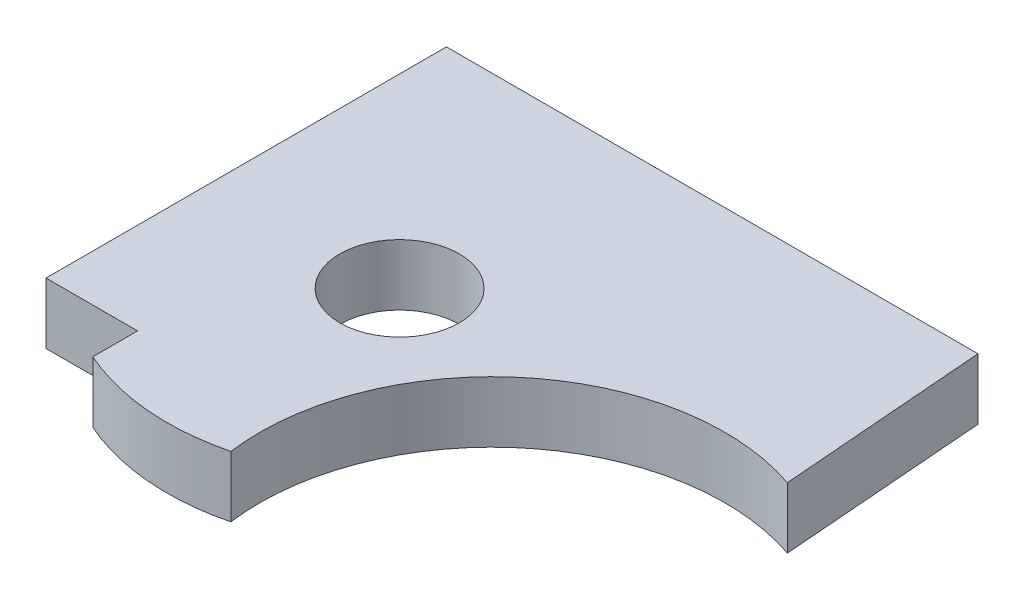
ISO-10303-21;
HEADER;
FILE_DESCRIPTION(('STEP AP214'),'2;1');
FILE_NAME('part.step','',(''),(''),'','','');
FILE_SCHEMA(('AUTOMOTIVE_DESIGN { 1 0 10303 214 1 1 1 1 }'));
ENDSEC;
DATA;
#1=APPLICATION_CONTEXT('core data for automotive mechanical design processes');
#2=APPLICATION_PROTOCOL_DEFINITION('international standard','automotive_design',2000,#1);
#3=PRODUCT_CONTEXT('',#1,'mechanical');
#4=PRODUCT('Part','Part','',(#3));
#5=PRODUCT_RELATED_PRODUCT_CATEGORY('part','',(#4));
#6=PRODUCT_DEFINITION_FORMATION('','',#4);
#7=PRODUCT_DEFINITION_CONTEXT('part definition',#1,'design');
#8=PRODUCT_DEFINITION('design','',#6,#7);
#9=PRODUCT_DEFINITION_SHAPE('','',#8);
#10=(LENGTH_UNIT() NAMED_UNIT(*) SI_UNIT(.MILLI.,.METRE.));
#11=(NAMED_UNIT(*) PLANE_ANGLE_UNIT() SI_UNIT($,.RADIAN.));
#12=(NAMED_UNIT(*) SI_UNIT($,.STERADIAN.) SOLID_ANGLE_UNIT());
#13=UNCERTAINTY_MEASURE_WITH_UNIT(LENGTH_MEASURE(1.E-05),#10,'distance_accuracy_value','');
#14=(GEOMETRIC_REPRESENTATION_CONTEXT(3) GLOBAL_UNCERTAINTY_ASSIGNED_CONTEXT((#13)) GLOBAL_UNIT_ASSIGNED_CONTEXT((#10,
#11,#12)) REPRESENTATION_CONTEXT('',''));
#15=CARTESIAN_POINT('',(0.,0.,0.));
#16=DIRECTION('',(0.,0.,1.));
#17=DIRECTION('',(1.,0.,0.));
#18=AXIS2_PLACEMENT_3D('',#15,#16,#17);
#19=CARTESIAN_POINT('',(137.296761577573,4.,-4.30517733110572));
#20=DIRECTION('',(0.,-1.,0.));
#21=DIRECTION('',(0.,0.,-1.));
#22=AXIS2_PLACEMENT_3D('',#19,#20,#21);
#23=CYLINDRICAL_SURFACE('',#22,15.2405233009274);
#24=CARTESIAN_POINT('',(137.296761577573,0.,-4.30517733110572));
#25=DIRECTION('',(0.,1.,0.));
#26=DIRECTION('',(0.,0.,1.));
#27=AXIS2_PLACEMENT_3D('',#24,#25,#26);
#28=CIRCLE('',#27,15.2405233009274);
#29=CARTESIAN_POINT('',(142.200280718909,0.,-18.7353211459351));
#30=VERTEX_POINT('',#29);
#31=CARTESIAN_POINT('',(122.1918078265,0.,-2.27689661481613));
#32=VERTEX_POINT('',#31);
#33=EDGE_CURVE('E202',#30,#32,#28,.T.);
#34=ORIENTED_EDGE('',*,*,#33,.F.);
#35=DIRECTION('',(0.,-1.,0.));
#36=VECTOR('',#35,1.);
#37=CARTESIAN_POINT('',(142.200280718909,4.,-18.7353211459351));
#38=LINE('',#37,#36);
#39=CARTESIAN_POINT('',(142.200280718909,4.,-18.7353211459351));
#40=VERTEX_POINT('',#39);
#41=EDGE_CURVE('E12',#40,#30,#38,.T.);
#42=ORIENTED_EDGE('',*,*,#41,.F.);
#43=CARTESIAN_POINT('',(137.296761577573,4.,-4.30517733110572));
#44=DIRECTION('',(0.,1.,0.));
#45=DIRECTION('',(0.,0.,1.));
#46=AXIS2_PLACEMENT_3D('',#43,#44,#45);
#47=CIRCLE('',#46,15.2405233009274);
#48=CARTESIAN_POINT('',(122.1918078265,4.,-2.27689661481613));
#49=VERTEX_POINT('',#48);
#50=EDGE_CURVE('E166',#40,#49,#47,.T.);
#51=ORIENTED_EDGE('',*,*,#50,.T.);
#52=DIRECTION('',(0.,-1.,0.));
#53=VECTOR('',#52,1.);
#54=CARTESIAN_POINT('',(122.1918078265,4.,-2.27689661481613));
#55=LINE('',#54,#53);
#56=EDGE_CURVE('E99',#49,#32,#55,.T.);
#57=ORIENTED_EDGE('',*,*,#56,.T.);
#58=EDGE_LOOP('',(#34,#42,#51,#57));
#59=FACE_BOUND('',#58,.T.);
#60=ADVANCED_FACE('F43',(#59),#23,.F.);
#61=CARTESIAN_POINT('',(142.789864863277,4.,-11.2561584708997));
#62=DIRECTION('',(-0.996907303645276,0.,0.0785864360987606));
#63=DIRECTION('',(0.0785864360987606,0.,0.996907303645276));
#64=AXIS2_PLACEMENT_3D('',#61,#62,#63);
#65=PLANE('',#64);
#66=DIRECTION('',(-0.0785864360987606,0.,-0.996907303645277));
#67=VECTOR('',#66,1.);
#68=CARTESIAN_POINT('',(142.789864863277,0.,-11.2561584708997));
#69=LINE('',#68,#67);
#70=CARTESIAN_POINT('',(141.131312829856,0.,-32.2957006320331));
#71=VERTEX_POINT('',#70);
#72=EDGE_CURVE('E198',#30,#71,#69,.T.);
#73=ORIENTED_EDGE('',*,*,#72,.T.);
#74=DIRECTION('',(0.,-1.,0.));
#75=VECTOR('',#74,1.);
#76=CARTESIAN_POINT('',(141.131312829856,4.,-32.2957006320331));
#77=LINE('',#76,#75);
#78=CARTESIAN_POINT('',(141.131312829856,4.,-32.2957006320331));
#79=VERTEX_POINT('',#78);
#80=EDGE_CURVE('E52',#79,#71,#77,.T.);
#81=ORIENTED_EDGE('',*,*,#80,.F.);
#82=DIRECTION('',(-0.0785864360987606,0.,-0.996907303645277));
#83=VECTOR('',#82,1.);
#84=CARTESIAN_POINT('',(142.789864863277,4.,-11.2561584708997));
#85=LINE('',#84,#83);
#86=EDGE_CURVE('E162',#40,#79,#85,.T.);
#87=ORIENTED_EDGE('',*,*,#86,.F.);
#88=ORIENTED_EDGE('',*,*,#41,.T.);
#89=EDGE_LOOP('',(#73,#81,#87,#88));
#90=FACE_BOUND('',#89,.T.);
#91=ADVANCED_FACE('F199',(#90),#65,.F.);
#92=CARTESIAN_POINT('',(0.,4.,-32.2957006320331));
#93=DIRECTION('',(0.,0.,-1.));
#94=DIRECTION('',(-1.,0.,0.));
#95=AXIS2_PLACEMENT_3D('',#92,#93,#94);
#96=PLANE('',#95);
#97=DIRECTION('',(1.,0.,0.));
#98=VECTOR('',#97,1.);
#99=CARTESIAN_POINT('',(0.,0.,-32.2957006320331));
#100=LINE('',#99,#98);
#101=CARTESIAN_POINT('',(106.296761577572,0.,-32.2957006320331));
#102=VERTEX_POINT('',#101);
#103=EDGE_CURVE('E195',#102,#71,#100,.T.);
#104=ORIENTED_EDGE('',*,*,#103,.F.);
#105=DIRECTION('',(0.,-1.,0.));
#106=VECTOR('',#105,1.);
#107=CARTESIAN_POINT('',(106.296761577572,4.,-32.2957006320331));
#108=LINE('',#107,#106);
#109=CARTESIAN_POINT('',(106.296761577572,4.,-32.2957006320331));
#110=VERTEX_POINT('',#109);
#111=EDGE_CURVE('E188',#110,#102,#108,.T.);
#112=ORIENTED_EDGE('',*,*,#111,.F.);
#113=DIRECTION('',(1.,0.,0.));
#114=VECTOR('',#113,1.);
#115=CARTESIAN_POINT('',(0.,4.,-32.2957006320331));
#116=LINE('',#115,#114);
#117=EDGE_CURVE('E157',#110,#79,#116,.T.);
#118=ORIENTED_EDGE('',*,*,#117,.T.);
#119=ORIENTED_EDGE('',*,*,#80,.T.);
#120=EDGE_LOOP('',(#104,#112,#118,#119));
#121=FACE_BOUND('',#120,.T.);
#122=ADVANCED_FACE('F193',(#121),#96,.T.);
#123=CARTESIAN_POINT('',(106.296761577572,4.,0.));
#124=DIRECTION('',(1.,0.,0.));
#125=DIRECTION('',(0.,0.,-1.));
#126=AXIS2_PLACEMENT_3D('',#123,#124,#125);
#127=PLANE('',#126);
#128=DIRECTION('',(0.,0.,1.));
#129=VECTOR('',#128,1.);
#130=CARTESIAN_POINT('',(106.296761577572,0.,0.));
#131=LINE('',#130,#129);
#132=CARTESIAN_POINT('',(106.296761577572,0.,-6.05517733110575));
#133=VERTEX_POINT('',#132);
#134=EDGE_CURVE('E207',#102,#133,#131,.T.);
#135=ORIENTED_EDGE('',*,*,#134,.T.);
#136=DIRECTION('',(0.,-1.,0.));
#137=VECTOR('',#136,1.);
#138=CARTESIAN_POINT('',(106.296761577572,4.,-6.05517733110575));
#139=LINE('',#138,#137);
#140=CARTESIAN_POINT('',(106.296761577572,4.,-6.05517733110575));
#141=VERTEX_POINT('',#140);
#142=EDGE_CURVE('E136',#141,#133,#139,.T.);
#143=ORIENTED_EDGE('',*,*,#142,.F.);
#144=DIRECTION('',(0.,0.,1.));
#145=VECTOR('',#144,1.);
#146=CARTESIAN_POINT('',(106.296761577572,4.,0.));
#147=LINE('',#146,#145);
#148=EDGE_CURVE('E125',#110,#141,#147,.T.);
#149=ORIENTED_EDGE('',*,*,#148,.F.);
#150=ORIENTED_EDGE('',*,*,#111,.T.);
#151=EDGE_LOOP('',(#135,#143,#149,#150));
#152=FACE_BOUND('',#151,.T.);
#153=ADVANCED_FACE('F226',(#152),#127,.F.);
#154=CARTESIAN_POINT('',(0.,4.,-6.05517733110575));
#155=DIRECTION('',(0.,0.,-1.));
#156=DIRECTION('',(-1.,0.,0.));
#157=AXIS2_PLACEMENT_3D('',#154,#155,#156);
#158=PLANE('',#157);
#159=DIRECTION('',(1.,0.,0.));
#160=VECTOR('',#159,1.);
#161=CARTESIAN_POINT('',(0.,0.,-6.05517733110575));
#162=LINE('',#161,#160);
#163=CARTESIAN_POINT('',(112.296761577573,0.,-6.05517733110575));
#164=VERTEX_POINT('',#163);
#165=EDGE_CURVE('E134',#133,#164,#162,.T.);
#166=ORIENTED_EDGE('',*,*,#165,.T.);
#167=DIRECTION('',(0.,-1.,0.));
#168=VECTOR('',#167,1.);
#169=CARTESIAN_POINT('',(112.296761577573,4.,-6.05517733110575));
#170=LINE('',#169,#168);
#171=CARTESIAN_POINT('',(112.296761577573,4.,-6.05517733110575));
#172=VERTEX_POINT('',#171);
#173=EDGE_CURVE('E131',#172,#164,#170,.T.);
#174=ORIENTED_EDGE('',*,*,#173,.F.);
#175=DIRECTION('',(1.,0.,0.));
#176=VECTOR('',#175,1.);
#177=CARTESIAN_POINT('',(0.,4.,-6.05517733110575));
#178=LINE('',#177,#176);
#179=EDGE_CURVE('E117',#141,#172,#178,.T.);
#180=ORIENTED_EDGE('',*,*,#179,.F.);
#181=ORIENTED_EDGE('',*,*,#142,.T.);
#182=EDGE_LOOP('',(#166,#174,#180,#181));
#183=FACE_BOUND('',#182,.T.);
#184=ADVANCED_FACE('F132',(#183),#158,.F.);
#185=CARTESIAN_POINT('',(112.296761577573,4.,3.30325947032491E-13));
#186=DIRECTION('',(1.,0.,0.));
#187=DIRECTION('',(0.,0.,-1.));
#188=AXIS2_PLACEMENT_3D('',#185,#186,#187);
#189=PLANE('',#188);
#190=DIRECTION('',(0.,0.,1.));
#191=VECTOR('',#190,1.);
#192=CARTESIAN_POINT('',(112.296761577573,0.,3.30325947032491E-13));
#193=LINE('',#192,#191);
#194=CARTESIAN_POINT('',(112.296761577573,0.,-3.11944446605268));
#195=VERTEX_POINT('',#194);
#196=EDGE_CURVE('E92',#164,#195,#193,.T.);
#197=ORIENTED_EDGE('',*,*,#196,.T.);
#198=DIRECTION('',(0.,-1.,0.));
#199=VECTOR('',#198,1.);
#200=CARTESIAN_POINT('',(112.296761577573,4.,-3.11944446605268));
#201=LINE('',#200,#199);
#202=CARTESIAN_POINT('',(112.296761577573,4.,-3.11944446605268));
#203=VERTEX_POINT('',#202);
#204=EDGE_CURVE('E137',#203,#195,#201,.T.);
#205=ORIENTED_EDGE('',*,*,#204,.F.);
#206=DIRECTION('',(0.,0.,1.));
#207=VECTOR('',#206,1.);
#208=CARTESIAN_POINT('',(112.296761577573,4.,3.30325947032491E-13));
#209=LINE('',#208,#207);
#210=EDGE_CURVE('E122',#172,#203,#209,.T.);
#211=ORIENTED_EDGE('',*,*,#210,.F.);
#212=ORIENTED_EDGE('',*,*,#173,.T.);
#213=EDGE_LOOP('',(#197,#205,#211,#212));
#214=FACE_BOUND('',#213,.T.);
#215=ADVANCED_FACE('F139',(#214),#189,.F.);
#216=CARTESIAN_POINT('',(118.466761577572,4.,-17.0551773311057));
#217=DIRECTION('',(0.,-1.,0.));
#218=DIRECTION('',(0.,0.,-1.));
#219=AXIS2_PLACEMENT_3D('',#216,#217,#218);
#220=CYLINDRICAL_SURFACE('',#219,15.2405233009274);
#221=CARTESIAN_POINT('',(118.466761577572,0.,-17.0551773311057));
#222=DIRECTION('',(0.,1.,0.));
#223=DIRECTION('',(0.,0.,1.));
#224=AXIS2_PLACEMENT_3D('',#221,#222,#223);
#225=CIRCLE('',#224,15.2405233009274);
#226=EDGE_CURVE('E175',#195,#32,#225,.T.);
#227=ORIENTED_EDGE('',*,*,#226,.T.);
#228=ORIENTED_EDGE('',*,*,#56,.F.);
#229=CARTESIAN_POINT('',(118.466761577572,4.,-17.0551773311057));
#230=DIRECTION('',(0.,1.,0.));
#231=DIRECTION('',(0.,0.,1.));
#232=AXIS2_PLACEMENT_3D('',#229,#230,#231);
#233=CIRCLE('',#232,15.2405233009274);
#234=EDGE_CURVE('E63',#203,#49,#233,.T.);
#235=ORIENTED_EDGE('',*,*,#234,.F.);
#236=ORIENTED_EDGE('',*,*,#204,.T.);
#237=EDGE_LOOP('',(#227,#228,#235,#236));
#238=FACE_BOUND('',#237,.T.);
#239=ADVANCED_FACE('F236',(#238),#220,.T.);
#240=CARTESIAN_POINT('',(118.466761577572,4.,-17.0551773311057));
#241=DIRECTION('',(0.,-1.,0.));
#242=DIRECTION('',(0.,0.,-1.));
#243=AXIS2_PLACEMENT_3D('',#240,#241,#242);
#244=CYLINDRICAL_SURFACE('',#243,3.915);
#245=CARTESIAN_POINT('',(118.466761577572,4.,-17.0551773311057));
#246=DIRECTION('',(0.,1.,0.));
#247=DIRECTION('',(0.,0.,1.));
#248=AXIS2_PLACEMENT_3D('',#245,#246,#247);
#249=CIRCLE('',#248,3.915);
#250=CARTESIAN_POINT('',(118.466761577572,4.,-13.1401773311057));
#251=VERTEX_POINT('',#250);
#252=EDGE_CURVE('E144',#251,#251,#249,.F.);
#253=ORIENTED_EDGE('',*,*,#252,.F.);
#254=EDGE_LOOP('',(#253));
#255=FACE_BOUND('',#254,.T.);
#256=CARTESIAN_POINT('',(118.466761577572,0.,-17.0551773311057));
#257=DIRECTION('',(0.,1.,0.));
#258=DIRECTION('',(0.,0.,1.));
#259=AXIS2_PLACEMENT_3D('',#256,#257,#258);
#260=CIRCLE('',#259,3.915);
#261=CARTESIAN_POINT('',(118.466761577572,0.,-13.1401773311057));
#262=VERTEX_POINT('',#261);
#263=EDGE_CURVE('E170',#262,#262,#260,.F.);
#264=ORIENTED_EDGE('',*,*,#263,.T.);
#265=EDGE_LOOP('',(#264));
#266=FACE_BOUND('',#265,.T.);
#267=ADVANCED_FACE('F239',(#255,#266),#244,.F.);
#268=CARTESIAN_POINT('',(0.,4.,0.));
#269=DIRECTION('',(0.,1.,0.));
#270=DIRECTION('',(0.,0.,1.));
#271=AXIS2_PLACEMENT_3D('',#268,#269,#270);
#272=PLANE('',#271);
#273=ORIENTED_EDGE('',*,*,#50,.F.);
#274=ORIENTED_EDGE('',*,*,#86,.T.);
#275=ORIENTED_EDGE('',*,*,#117,.F.);
#276=ORIENTED_EDGE('',*,*,#148,.T.);
#277=ORIENTED_EDGE('',*,*,#179,.T.);
#278=ORIENTED_EDGE('',*,*,#210,.T.);
#279=ORIENTED_EDGE('',*,*,#234,.T.);
#280=EDGE_LOOP('',(#273,#274,#275,#276,#277,#278,#279));
#281=FACE_BOUND('',#280,.T.);
#282=ORIENTED_EDGE('',*,*,#252,.T.);
#283=EDGE_LOOP('',(#282));
#284=FACE_BOUND('',#283,.T.);
#285=ADVANCED_FACE('F119',(#281,#284),#272,.T.);
#286=CARTESIAN_POINT('',(0.,0.,0.));
#287=DIRECTION('',(0.,1.,0.));
#288=DIRECTION('',(0.,0.,1.));
#289=AXIS2_PLACEMENT_3D('',#286,#287,#288);
#290=PLANE('',#289);
#291=ORIENTED_EDGE('',*,*,#33,.T.);
#292=ORIENTED_EDGE('',*,*,#226,.F.);
#293=ORIENTED_EDGE('',*,*,#196,.F.);
#294=ORIENTED_EDGE('',*,*,#165,.F.);
#295=ORIENTED_EDGE('',*,*,#134,.F.);
#296=ORIENTED_EDGE('',*,*,#103,.T.);
#297=ORIENTED_EDGE('',*,*,#72,.F.);
#298=EDGE_LOOP('',(#291,#292,#293,#294,#295,#296,#297));
#299=FACE_BOUND('',#298,.T.);
#300=ORIENTED_EDGE('',*,*,#263,.F.);
#301=EDGE_LOOP('',(#300));
#302=FACE_BOUND('',#301,.T.);
#303=ADVANCED_FACE('F205',(#299,#302),#290,.F.);
#304=CLOSED_SHELL('',(#60,#91,#122,#153,#184,#215,#239,#267,#285,#303));
#305=MANIFOLD_SOLID_BREP('B2',#304);
#306=ADVANCED_BREP_SHAPE_REPRESENTATION('',(#18,#305),#14);
#307=SHAPE_DEFINITION_REPRESENTATION(#9,#306);
ENDSEC;
END-ISO-10303-21;
